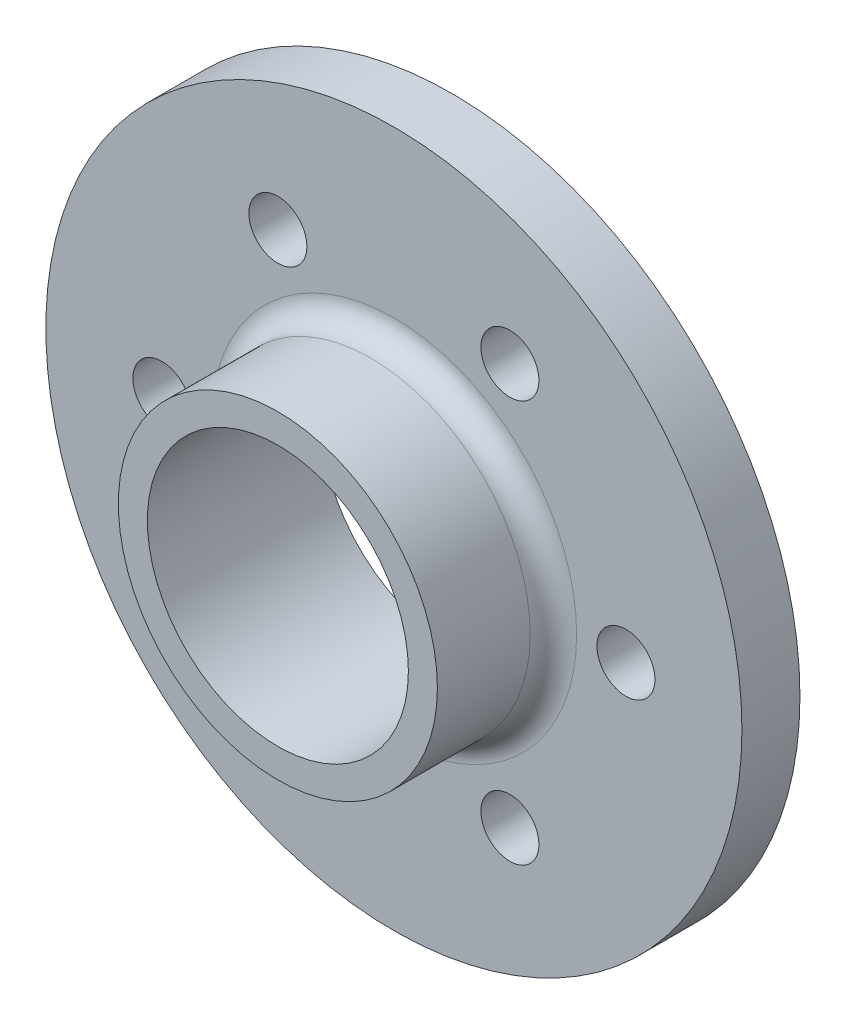
ISO-10303-21;
HEADER;
FILE_DESCRIPTION(('STEP AP214'),'2;1');
FILE_NAME('part.step','',(''),(''),'','','');
FILE_SCHEMA(('AUTOMOTIVE_DESIGN { 1 0 10303 214 1 1 1 1 }'));
ENDSEC;
DATA;
#1=APPLICATION_CONTEXT('core data for automotive mechanical design processes');
#2=APPLICATION_PROTOCOL_DEFINITION('international standard','automotive_design',2000,#1);
#3=PRODUCT_CONTEXT('',#1,'mechanical');
#4=PRODUCT('Part','Part','',(#3));
#5=PRODUCT_RELATED_PRODUCT_CATEGORY('part','',(#4));
#6=PRODUCT_DEFINITION_FORMATION('','',#4);
#7=PRODUCT_DEFINITION_CONTEXT('part definition',#1,'design');
#8=PRODUCT_DEFINITION('design','',#6,#7);
#9=PRODUCT_DEFINITION_SHAPE('','',#8);
#10=(LENGTH_UNIT() NAMED_UNIT(*) SI_UNIT(.MILLI.,.METRE.));
#11=(NAMED_UNIT(*) PLANE_ANGLE_UNIT() SI_UNIT($,.RADIAN.));
#12=(NAMED_UNIT(*) SI_UNIT($,.STERADIAN.) SOLID_ANGLE_UNIT());
#13=UNCERTAINTY_MEASURE_WITH_UNIT(LENGTH_MEASURE(1.E-05),#10,'distance_accuracy_value','');
#14=(GEOMETRIC_REPRESENTATION_CONTEXT(3) GLOBAL_UNCERTAINTY_ASSIGNED_CONTEXT((#13)) GLOBAL_UNIT_ASSIGNED_CONTEXT((#10,
#11,#12)) REPRESENTATION_CONTEXT('',''));
#15=CARTESIAN_POINT('',(0.,0.,0.));
#16=DIRECTION('',(0.,0.,1.));
#17=DIRECTION('',(1.,0.,0.));
#18=AXIS2_PLACEMENT_3D('',#15,#16,#17);
#19=CARTESIAN_POINT('',(0.,0.,6.35));
#20=DIRECTION('',(0.,0.,-1.));
#21=DIRECTION('',(-1.,0.,0.));
#22=AXIS2_PLACEMENT_3D('',#19,#20,#21);
#23=CYLINDRICAL_SURFACE('',#22,38.1);
#24=CARTESIAN_POINT('',(0.,0.,6.35));
#25=DIRECTION('',(0.,0.,1.));
#26=DIRECTION('',(1.,0.,0.));
#27=AXIS2_PLACEMENT_3D('',#24,#25,#26);
#28=CIRCLE('',#27,38.1);
#29=CARTESIAN_POINT('',(38.1,0.,6.35));
#30=VERTEX_POINT('',#29);
#31=EDGE_CURVE('E58',#30,#30,#28,.T.);
#32=ORIENTED_EDGE('',*,*,#31,.F.);
#33=EDGE_LOOP('',(#32));
#34=FACE_BOUND('',#33,.T.);
#35=CARTESIAN_POINT('',(0.,0.,0.));
#36=DIRECTION('',(0.,0.,1.));
#37=DIRECTION('',(1.,0.,0.));
#38=AXIS2_PLACEMENT_3D('',#35,#36,#37);
#39=CIRCLE('',#38,38.1);
#40=CARTESIAN_POINT('',(38.1,0.,0.));
#41=VERTEX_POINT('',#40);
#42=EDGE_CURVE('E63',#41,#41,#39,.T.);
#43=ORIENTED_EDGE('',*,*,#42,.T.);
#44=EDGE_LOOP('',(#43));
#45=FACE_BOUND('',#44,.T.);
#46=ADVANCED_FACE('F45',(#34,#45),#23,.T.);
#47=CARTESIAN_POINT('',(0.,0.,6.35));
#48=DIRECTION('',(0.,0.,1.));
#49=DIRECTION('',(1.,0.,0.));
#50=AXIS2_PLACEMENT_3D('',#47,#48,#49);
#51=PLANE('',#50);
#52=CARTESIAN_POINT('',(25.4,0.,6.35));
#53=DIRECTION('',(0.,0.,1.));
#54=DIRECTION('',(1.,0.,0.));
#55=AXIS2_PLACEMENT_3D('',#52,#53,#54);
#56=CIRCLE('',#55,3.175);
#57=CARTESIAN_POINT('',(28.575,0.,6.35));
#58=VERTEX_POINT('',#57);
#59=EDGE_CURVE('E81',#58,#58,#56,.T.);
#60=ORIENTED_EDGE('',*,*,#59,.F.);
#61=EDGE_LOOP('',(#60));
#62=FACE_BOUND('',#61,.T.);
#63=CARTESIAN_POINT('',(12.7000000000003,-21.9970452561246,6.35));
#64=DIRECTION('',(0.,0.,1.));
#65=DIRECTION('',(1.,0.,0.));
#66=AXIS2_PLACEMENT_3D('',#63,#64,#65);
#67=CIRCLE('',#66,3.175);
#68=CARTESIAN_POINT('',(15.8750000000003,-21.9970452561246,6.35));
#69=VERTEX_POINT('',#68);
#70=EDGE_CURVE('E85',#69,#69,#67,.T.);
#71=ORIENTED_EDGE('',*,*,#70,.F.);
#72=EDGE_LOOP('',(#71));
#73=FACE_BOUND('',#72,.T.);
#74=CARTESIAN_POINT('',(-12.6999999999998,-21.9970452561249,6.35));
#75=DIRECTION('',(0.,0.,1.));
#76=DIRECTION('',(1.,0.,0.));
#77=AXIS2_PLACEMENT_3D('',#74,#75,#76);
#78=CIRCLE('',#77,3.175);
#79=CARTESIAN_POINT('',(-9.52499999999979,-21.9970452561249,6.35));
#80=VERTEX_POINT('',#79);
#81=EDGE_CURVE('E89',#80,#80,#78,.T.);
#82=ORIENTED_EDGE('',*,*,#81,.F.);
#83=EDGE_LOOP('',(#82));
#84=FACE_BOUND('',#83,.T.);
#85=CARTESIAN_POINT('',(-25.4,-1.77367252013231E-13,6.35));
#86=DIRECTION('',(0.,0.,1.));
#87=DIRECTION('',(1.,0.,0.));
#88=AXIS2_PLACEMENT_3D('',#85,#86,#87);
#89=CIRCLE('',#88,3.175);
#90=CARTESIAN_POINT('',(-22.225,-1.77367252013231E-13,6.35));
#91=VERTEX_POINT('',#90);
#92=EDGE_CURVE('E93',#91,#91,#89,.T.);
#93=ORIENTED_EDGE('',*,*,#92,.F.);
#94=EDGE_LOOP('',(#93));
#95=FACE_BOUND('',#94,.T.);
#96=CARTESIAN_POINT('',(-12.7000000000001,21.9970452561247,6.35));
#97=DIRECTION('',(0.,0.,1.));
#98=DIRECTION('',(1.,0.,0.));
#99=AXIS2_PLACEMENT_3D('',#96,#97,#98);
#100=CIRCLE('',#99,3.17500000000001);
#101=CARTESIAN_POINT('',(-9.5250000000001,21.9970452561247,6.35));
#102=VERTEX_POINT('',#101);
#103=EDGE_CURVE('E97',#102,#102,#100,.T.);
#104=ORIENTED_EDGE('',*,*,#103,.F.);
#105=EDGE_LOOP('',(#104));
#106=FACE_BOUND('',#105,.T.);
#107=CARTESIAN_POINT('',(12.6999999999999,21.9970452561248,6.35));
#108=DIRECTION('',(0.,0.,1.));
#109=DIRECTION('',(1.,0.,0.));
#110=AXIS2_PLACEMENT_3D('',#107,#108,#109);
#111=CIRCLE('',#110,3.175);
#112=CARTESIAN_POINT('',(15.875,21.9970452561248,6.35));
#113=VERTEX_POINT('',#112);
#114=EDGE_CURVE('E101',#113,#113,#111,.T.);
#115=ORIENTED_EDGE('',*,*,#114,.F.);
#116=EDGE_LOOP('',(#115));
#117=FACE_BOUND('',#116,.T.);
#118=CARTESIAN_POINT('',(0.,0.,6.35));
#119=DIRECTION('',(0.,0.,1.));
#120=DIRECTION('',(1.,0.,0.));
#121=AXIS2_PLACEMENT_3D('',#118,#119,#120);
#122=CIRCLE('',#121,20.0025);
#123=CARTESIAN_POINT('',(20.0025,0.,6.35));
#124=VERTEX_POINT('',#123);
#125=EDGE_CURVE('E10',#124,#124,#122,.F.);
#126=ORIENTED_EDGE('',*,*,#125,.T.);
#127=EDGE_LOOP('',(#126));
#128=FACE_BOUND('',#127,.T.);
#129=ORIENTED_EDGE('',*,*,#31,.T.);
#130=EDGE_LOOP('',(#129));
#131=FACE_BOUND('',#130,.T.);
#132=ADVANCED_FACE('F136',(#62,#73,#84,#95,#106,#117,#128,#131),#51,.T.);
#133=CARTESIAN_POINT('',(0.,0.,0.));
#134=DIRECTION('',(0.,0.,1.));
#135=DIRECTION('',(1.,0.,0.));
#136=AXIS2_PLACEMENT_3D('',#133,#134,#135);
#137=PLANE('',#136);
#138=CARTESIAN_POINT('',(25.4,0.,0.));
#139=DIRECTION('',(0.,0.,-1.));
#140=DIRECTION('',(-1.,0.,0.));
#141=AXIS2_PLACEMENT_3D('',#138,#139,#140);
#142=CIRCLE('',#141,3.175);
#143=CARTESIAN_POINT('',(22.225,0.,0.));
#144=VERTEX_POINT('',#143);
#145=EDGE_CURVE('E105',#144,#144,#142,.T.);
#146=ORIENTED_EDGE('',*,*,#145,.F.);
#147=EDGE_LOOP('',(#146));
#148=FACE_BOUND('',#147,.T.);
#149=CARTESIAN_POINT('',(12.7000000000003,-21.9970452561246,0.));
#150=DIRECTION('',(0.,0.,-1.));
#151=DIRECTION('',(-1.,0.,0.));
#152=AXIS2_PLACEMENT_3D('',#149,#150,#151);
#153=CIRCLE('',#152,3.175);
#154=CARTESIAN_POINT('',(9.52500000000026,-21.9970452561246,0.));
#155=VERTEX_POINT('',#154);
#156=EDGE_CURVE('E111',#155,#155,#153,.T.);
#157=ORIENTED_EDGE('',*,*,#156,.F.);
#158=EDGE_LOOP('',(#157));
#159=FACE_BOUND('',#158,.T.);
#160=CARTESIAN_POINT('',(-12.6999999999998,-21.9970452561249,0.));
#161=DIRECTION('',(0.,0.,-1.));
#162=DIRECTION('',(-1.,0.,0.));
#163=AXIS2_PLACEMENT_3D('',#160,#161,#162);
#164=CIRCLE('',#163,3.175);
#165=CARTESIAN_POINT('',(-15.8749999999998,-21.9970452561249,0.));
#166=VERTEX_POINT('',#165);
#167=EDGE_CURVE('E106',#166,#166,#164,.T.);
#168=ORIENTED_EDGE('',*,*,#167,.F.);
#169=EDGE_LOOP('',(#168));
#170=FACE_BOUND('',#169,.T.);
#171=CARTESIAN_POINT('',(-25.4,-1.77367252013231E-13,0.));
#172=DIRECTION('',(0.,0.,-1.));
#173=DIRECTION('',(-1.,0.,0.));
#174=AXIS2_PLACEMENT_3D('',#171,#172,#173);
#175=CIRCLE('',#174,3.175);
#176=CARTESIAN_POINT('',(-28.575,-1.77367252013231E-13,0.));
#177=VERTEX_POINT('',#176);
#178=EDGE_CURVE('E110',#177,#177,#175,.T.);
#179=ORIENTED_EDGE('',*,*,#178,.F.);
#180=EDGE_LOOP('',(#179));
#181=FACE_BOUND('',#180,.T.);
#182=CARTESIAN_POINT('',(-12.7000000000001,21.9970452561247,0.));
#183=DIRECTION('',(0.,0.,-1.));
#184=DIRECTION('',(-1.,0.,0.));
#185=AXIS2_PLACEMENT_3D('',#182,#183,#184);
#186=CIRCLE('',#185,3.17500000000001);
#187=CARTESIAN_POINT('',(-15.8750000000001,21.9970452561247,0.));
#188=VERTEX_POINT('',#187);
#189=EDGE_CURVE('E115',#188,#188,#186,.T.);
#190=ORIENTED_EDGE('',*,*,#189,.F.);
#191=EDGE_LOOP('',(#190));
#192=FACE_BOUND('',#191,.T.);
#193=CARTESIAN_POINT('',(12.6999999999999,21.9970452561248,0.));
#194=DIRECTION('',(0.,0.,-1.));
#195=DIRECTION('',(-1.,0.,0.));
#196=AXIS2_PLACEMENT_3D('',#193,#194,#195);
#197=CIRCLE('',#196,3.175);
#198=CARTESIAN_POINT('',(9.52499999999995,21.9970452561248,0.));
#199=VERTEX_POINT('',#198);
#200=EDGE_CURVE('E119',#199,#199,#197,.T.);
#201=ORIENTED_EDGE('',*,*,#200,.F.);
#202=EDGE_LOOP('',(#201));
#203=FACE_BOUND('',#202,.T.);
#204=CARTESIAN_POINT('',(0.,0.,0.));
#205=DIRECTION('',(0.,0.,1.));
#206=DIRECTION('',(1.,0.,0.));
#207=AXIS2_PLACEMENT_3D('',#204,#205,#206);
#208=CIRCLE('',#207,14.2875);
#209=CARTESIAN_POINT('',(14.2875,0.,0.));
#210=VERTEX_POINT('',#209);
#211=EDGE_CURVE('E73',#210,#210,#208,.F.);
#212=ORIENTED_EDGE('',*,*,#211,.F.);
#213=EDGE_LOOP('',(#212));
#214=FACE_BOUND('',#213,.T.);
#215=ORIENTED_EDGE('',*,*,#42,.F.);
#216=EDGE_LOOP('',(#215));
#217=FACE_BOUND('',#216,.T.);
#218=ADVANCED_FACE('F132',(#148,#159,#170,#181,#192,#203,#214,#217),#137,.F.);
#219=CARTESIAN_POINT('',(0.,0.,19.05));
#220=DIRECTION('',(0.,0.,-1.));
#221=DIRECTION('',(-1.,0.,0.));
#222=AXIS2_PLACEMENT_3D('',#219,#220,#221);
#223=CYLINDRICAL_SURFACE('',#222,17.4625);
#224=CARTESIAN_POINT('',(0.,0.,8.89));
#225=DIRECTION('',(0.,0.,1.));
#226=DIRECTION('',(1.,0.,0.));
#227=AXIS2_PLACEMENT_3D('',#224,#225,#226);
#228=CIRCLE('',#227,17.4625);
#229=CARTESIAN_POINT('',(17.4625,0.,8.89));
#230=VERTEX_POINT('',#229);
#231=EDGE_CURVE('E53',#230,#230,#228,.T.);
#232=ORIENTED_EDGE('',*,*,#231,.T.);
#233=EDGE_LOOP('',(#232));
#234=FACE_BOUND('',#233,.T.);
#235=CARTESIAN_POINT('',(0.,0.,19.05));
#236=DIRECTION('',(0.,0.,1.));
#237=DIRECTION('',(1.,0.,0.));
#238=AXIS2_PLACEMENT_3D('',#235,#236,#237);
#239=CIRCLE('',#238,17.4625);
#240=CARTESIAN_POINT('',(17.4625,0.,19.05));
#241=VERTEX_POINT('',#240);
#242=EDGE_CURVE('E68',#241,#241,#239,.T.);
#243=ORIENTED_EDGE('',*,*,#242,.F.);
#244=EDGE_LOOP('',(#243));
#245=FACE_BOUND('',#244,.T.);
#246=ADVANCED_FACE('F135',(#234,#245),#223,.T.);
#247=CARTESIAN_POINT('',(0.,0.,19.05));
#248=DIRECTION('',(0.,0.,1.));
#249=DIRECTION('',(1.,0.,0.));
#250=AXIS2_PLACEMENT_3D('',#247,#248,#249);
#251=PLANE('',#250);
#252=CARTESIAN_POINT('',(0.,0.,19.05));
#253=DIRECTION('',(0.,0.,1.));
#254=DIRECTION('',(1.,0.,0.));
#255=AXIS2_PLACEMENT_3D('',#252,#253,#254);
#256=CIRCLE('',#255,14.2875);
#257=CARTESIAN_POINT('',(14.2875,0.,19.05));
#258=VERTEX_POINT('',#257);
#259=EDGE_CURVE('E77',#258,#258,#256,.T.);
#260=ORIENTED_EDGE('',*,*,#259,.F.);
#261=EDGE_LOOP('',(#260));
#262=FACE_BOUND('',#261,.T.);
#263=ORIENTED_EDGE('',*,*,#242,.T.);
#264=EDGE_LOOP('',(#263));
#265=FACE_BOUND('',#264,.T.);
#266=ADVANCED_FACE('F163',(#262,#265),#251,.T.);
#267=CARTESIAN_POINT('',(0.,0.,8.89));
#268=DIRECTION('',(0.,0.,1.));
#269=DIRECTION('',(1.,0.,0.));
#270=AXIS2_PLACEMENT_3D('',#267,#268,#269);
#271=TOROIDAL_SURFACE('',#270,20.0025,2.54);
#272=ORIENTED_EDGE('',*,*,#125,.F.);
#273=EDGE_LOOP('',(#272));
#274=FACE_BOUND('',#273,.T.);
#275=ORIENTED_EDGE('',*,*,#231,.F.);
#276=EDGE_LOOP('',(#275));
#277=FACE_BOUND('',#276,.T.);
#278=ADVANCED_FACE('F47',(#274,#277),#271,.F.);
#279=CARTESIAN_POINT('',(0.,0.,-0.001000000000001));
#280=DIRECTION('',(0.,0.,1.));
#281=DIRECTION('',(1.,0.,0.));
#282=AXIS2_PLACEMENT_3D('',#279,#280,#281);
#283=CYLINDRICAL_SURFACE('',#282,14.2875);
#284=ORIENTED_EDGE('',*,*,#259,.T.);
#285=EDGE_LOOP('',(#284));
#286=FACE_BOUND('',#285,.T.);
#287=ORIENTED_EDGE('',*,*,#211,.T.);
#288=EDGE_LOOP('',(#287));
#289=FACE_BOUND('',#288,.T.);
#290=ADVANCED_FACE('F167',(#286,#289),#283,.F.);
#291=CARTESIAN_POINT('',(12.6999999999999,21.9970452561248,19.05));
#292=DIRECTION('',(0.,0.,-1.));
#293=DIRECTION('',(-1.,0.,0.));
#294=AXIS2_PLACEMENT_3D('',#291,#292,#293);
#295=CYLINDRICAL_SURFACE('',#294,3.175);
#296=ORIENTED_EDGE('',*,*,#114,.T.);
#297=EDGE_LOOP('',(#296));
#298=FACE_BOUND('',#297,.T.);
#299=ORIENTED_EDGE('',*,*,#200,.T.);
#300=EDGE_LOOP('',(#299));
#301=FACE_BOUND('',#300,.T.);
#302=ADVANCED_FACE('F170',(#298,#301),#295,.F.);
#303=CARTESIAN_POINT('',(-12.7000000000001,21.9970452561247,19.05));
#304=DIRECTION('',(0.,0.,-1.));
#305=DIRECTION('',(-1.,0.,0.));
#306=AXIS2_PLACEMENT_3D('',#303,#304,#305);
#307=CYLINDRICAL_SURFACE('',#306,3.17500000000001);
#308=ORIENTED_EDGE('',*,*,#103,.T.);
#309=EDGE_LOOP('',(#308));
#310=FACE_BOUND('',#309,.T.);
#311=ORIENTED_EDGE('',*,*,#189,.T.);
#312=EDGE_LOOP('',(#311));
#313=FACE_BOUND('',#312,.T.);
#314=ADVANCED_FACE('F180',(#310,#313),#307,.F.);
#315=CARTESIAN_POINT('',(-25.4,-1.77367252013231E-13,19.05));
#316=DIRECTION('',(0.,0.,-1.));
#317=DIRECTION('',(-1.,0.,0.));
#318=AXIS2_PLACEMENT_3D('',#315,#316,#317);
#319=CYLINDRICAL_SURFACE('',#318,3.175);
#320=ORIENTED_EDGE('',*,*,#92,.T.);
#321=EDGE_LOOP('',(#320));
#322=FACE_BOUND('',#321,.T.);
#323=ORIENTED_EDGE('',*,*,#178,.T.);
#324=EDGE_LOOP('',(#323));
#325=FACE_BOUND('',#324,.T.);
#326=ADVANCED_FACE('F176',(#322,#325),#319,.F.);
#327=CARTESIAN_POINT('',(-12.6999999999998,-21.9970452561249,19.05));
#328=DIRECTION('',(0.,0.,-1.));
#329=DIRECTION('',(-1.,0.,0.));
#330=AXIS2_PLACEMENT_3D('',#327,#328,#329);
#331=CYLINDRICAL_SURFACE('',#330,3.175);
#332=ORIENTED_EDGE('',*,*,#81,.T.);
#333=EDGE_LOOP('',(#332));
#334=FACE_BOUND('',#333,.T.);
#335=ORIENTED_EDGE('',*,*,#167,.T.);
#336=EDGE_LOOP('',(#335));
#337=FACE_BOUND('',#336,.T.);
#338=ADVANCED_FACE('F172',(#334,#337),#331,.F.);
#339=CARTESIAN_POINT('',(12.7000000000003,-21.9970452561246,19.05));
#340=DIRECTION('',(0.,0.,-1.));
#341=DIRECTION('',(-1.,0.,0.));
#342=AXIS2_PLACEMENT_3D('',#339,#340,#341);
#343=CYLINDRICAL_SURFACE('',#342,3.175);
#344=ORIENTED_EDGE('',*,*,#70,.T.);
#345=EDGE_LOOP('',(#344));
#346=FACE_BOUND('',#345,.T.);
#347=ORIENTED_EDGE('',*,*,#156,.T.);
#348=EDGE_LOOP('',(#347));
#349=FACE_BOUND('',#348,.T.);
#350=ADVANCED_FACE('F175',(#346,#349),#343,.F.);
#351=CARTESIAN_POINT('',(25.4,0.,19.05));
#352=DIRECTION('',(0.,0.,-1.));
#353=DIRECTION('',(-1.,0.,0.));
#354=AXIS2_PLACEMENT_3D('',#351,#352,#353);
#355=CYLINDRICAL_SURFACE('',#354,3.175);
#356=ORIENTED_EDGE('',*,*,#59,.T.);
#357=EDGE_LOOP('',(#356));
#358=FACE_BOUND('',#357,.T.);
#359=ORIENTED_EDGE('',*,*,#145,.T.);
#360=EDGE_LOOP('',(#359));
#361=FACE_BOUND('',#360,.T.);
#362=ADVANCED_FACE('F130',(#358,#361),#355,.F.);
#363=CLOSED_SHELL('',(#46,#132,#218,#246,#266,#278,#290,#302,#314,#326,#338,#350,#362));
#364=MANIFOLD_SOLID_BREP('B2',#363);
#365=ADVANCED_BREP_SHAPE_REPRESENTATION('',(#18,#364),#14);
#366=SHAPE_DEFINITION_REPRESENTATION(#9,#365);
ENDSEC;
END-ISO-10303-21;
